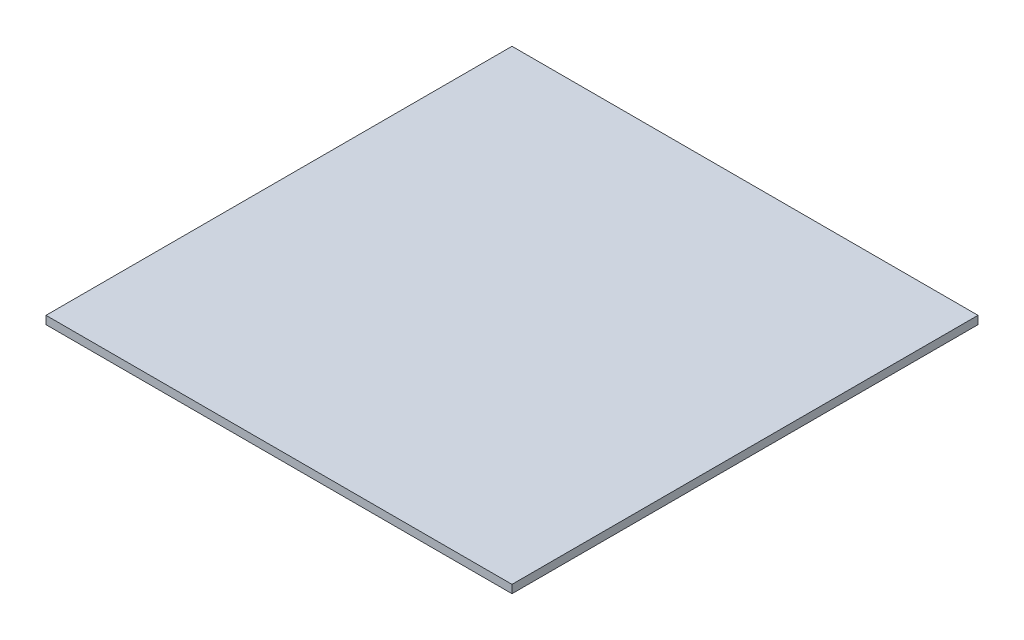
ISO-10303-21;
HEADER;
FILE_DESCRIPTION(('STEP AP214'),'2;1');
FILE_NAME('part.step','',(''),(''),'','','');
FILE_SCHEMA(('AUTOMOTIVE_DESIGN { 1 0 10303 214 1 1 1 1 }'));
ENDSEC;
DATA;
#1=APPLICATION_CONTEXT('core data for automotive mechanical design processes');
#2=APPLICATION_PROTOCOL_DEFINITION('international standard','automotive_design',2000,#1);
#3=PRODUCT_CONTEXT('',#1,'mechanical');
#4=PRODUCT('Part','Part','',(#3));
#5=PRODUCT_RELATED_PRODUCT_CATEGORY('part','',(#4));
#6=PRODUCT_DEFINITION_FORMATION('','',#4);
#7=PRODUCT_DEFINITION_CONTEXT('part definition',#1,'design');
#8=PRODUCT_DEFINITION('design','',#6,#7);
#9=PRODUCT_DEFINITION_SHAPE('','',#8);
#10=(LENGTH_UNIT() NAMED_UNIT(*) SI_UNIT(.MILLI.,.METRE.));
#11=(NAMED_UNIT(*) PLANE_ANGLE_UNIT() SI_UNIT($,.RADIAN.));
#12=(NAMED_UNIT(*) SI_UNIT($,.STERADIAN.) SOLID_ANGLE_UNIT());
#13=UNCERTAINTY_MEASURE_WITH_UNIT(LENGTH_MEASURE(1.E-05),#10,'distance_accuracy_value','');
#14=(GEOMETRIC_REPRESENTATION_CONTEXT(3) GLOBAL_UNCERTAINTY_ASSIGNED_CONTEXT((#13)) GLOBAL_UNIT_ASSIGNED_CONTEXT((#10,
#11,#12)) REPRESENTATION_CONTEXT('',''));
#15=CARTESIAN_POINT('',(0.,0.,0.));
#16=DIRECTION('',(0.,0.,1.));
#17=DIRECTION('',(1.,0.,0.));
#18=AXIS2_PLACEMENT_3D('',#15,#16,#17);
#19=CARTESIAN_POINT('',(1064.35051927814,15.,-4519.85577216972));
#20=DIRECTION('',(-1.,0.,0.));
#21=DIRECTION('',(0.,0.,1.));
#22=AXIS2_PLACEMENT_3D('',#19,#20,#21);
#23=PLANE('',#22);
#24=DIRECTION('',(0.,0.,-1.));
#25=VECTOR('',#24,1.);
#26=CARTESIAN_POINT('',(1064.35051927814,0.,-4519.85577216972));
#27=LINE('',#26,#25);
#28=CARTESIAN_POINT('',(1064.35051927814,0.,-3659.85577216972));
#29=VERTEX_POINT('',#28);
#30=CARTESIAN_POINT('',(1064.35051927814,0.,-4519.85577216972));
#31=VERTEX_POINT('',#30);
#32=EDGE_CURVE('E96',#29,#31,#27,.T.);
#33=ORIENTED_EDGE('',*,*,#32,.T.);
#34=DIRECTION('',(0.,-1.,0.));
#35=VECTOR('',#34,1.);
#36=CARTESIAN_POINT('',(1064.35051927814,15.,-4519.85577216972));
#37=LINE('',#36,#35);
#38=CARTESIAN_POINT('',(1064.35051927814,15.,-4519.85577216972));
#39=VERTEX_POINT('',#38);
#40=EDGE_CURVE('E11',#39,#31,#37,.T.);
#41=ORIENTED_EDGE('',*,*,#40,.F.);
#42=DIRECTION('',(0.,0.,-1.));
#43=VECTOR('',#42,1.);
#44=CARTESIAN_POINT('',(1064.35051927814,15.,-4519.85577216972));
#45=LINE('',#44,#43);
#46=CARTESIAN_POINT('',(1064.35051927814,15.,-3659.85577216972));
#47=VERTEX_POINT('',#46);
#48=EDGE_CURVE('E84',#47,#39,#45,.T.);
#49=ORIENTED_EDGE('',*,*,#48,.F.);
#50=DIRECTION('',(0.,-1.,0.));
#51=VECTOR('',#50,1.);
#52=CARTESIAN_POINT('',(1064.35051927814,15.,-3659.85577216972));
#53=LINE('',#52,#51);
#54=EDGE_CURVE('E92',#47,#29,#53,.T.);
#55=ORIENTED_EDGE('',*,*,#54,.T.);
#56=EDGE_LOOP('',(#33,#41,#49,#55));
#57=FACE_BOUND('',#56,.T.);
#58=ADVANCED_FACE('F33',(#57),#23,.F.);
#59=CARTESIAN_POINT('',(1064.35051927814,15.,-4519.85577216972));
#60=DIRECTION('',(0.,0.,1.));
#61=DIRECTION('',(1.,0.,0.));
#62=AXIS2_PLACEMENT_3D('',#59,#60,#61);
#63=PLANE('',#62);
#64=DIRECTION('',(-1.,0.,0.));
#65=VECTOR('',#64,1.);
#66=CARTESIAN_POINT('',(1064.35051927814,0.,-4519.85577216972));
#67=LINE('',#66,#65);
#68=CARTESIAN_POINT('',(204.350519278142,0.,-4519.85577216972));
#69=VERTEX_POINT('',#68);
#70=EDGE_CURVE('E88',#31,#69,#67,.T.);
#71=ORIENTED_EDGE('',*,*,#70,.T.);
#72=DIRECTION('',(0.,-1.,0.));
#73=VECTOR('',#72,1.);
#74=CARTESIAN_POINT('',(204.350519278142,15.,-4519.85577216972));
#75=LINE('',#74,#73);
#76=CARTESIAN_POINT('',(204.350519278142,15.,-4519.85577216972));
#77=VERTEX_POINT('',#76);
#78=EDGE_CURVE('E41',#77,#69,#75,.T.);
#79=ORIENTED_EDGE('',*,*,#78,.F.);
#80=DIRECTION('',(-1.,0.,0.));
#81=VECTOR('',#80,1.);
#82=CARTESIAN_POINT('',(1064.35051927814,15.,-4519.85577216972));
#83=LINE('',#82,#81);
#84=EDGE_CURVE('E79',#39,#77,#83,.T.);
#85=ORIENTED_EDGE('',*,*,#84,.F.);
#86=ORIENTED_EDGE('',*,*,#40,.T.);
#87=EDGE_LOOP('',(#71,#79,#85,#86));
#88=FACE_BOUND('',#87,.T.);
#89=ADVANCED_FACE('F87',(#88),#63,.F.);
#90=CARTESIAN_POINT('',(204.350519278142,15.,-4519.85577216972));
#91=DIRECTION('',(1.,0.,0.));
#92=DIRECTION('',(0.,0.,-1.));
#93=AXIS2_PLACEMENT_3D('',#90,#91,#92);
#94=PLANE('',#93);
#95=DIRECTION('',(0.,0.,1.));
#96=VECTOR('',#95,1.);
#97=CARTESIAN_POINT('',(204.350519278142,0.,-4519.85577216972));
#98=LINE('',#97,#96);
#99=CARTESIAN_POINT('',(204.350519278142,0.,-3659.85577216972));
#100=VERTEX_POINT('',#99);
#101=EDGE_CURVE('E66',#69,#100,#98,.T.);
#102=ORIENTED_EDGE('',*,*,#101,.T.);
#103=DIRECTION('',(0.,-1.,0.));
#104=VECTOR('',#103,1.);
#105=CARTESIAN_POINT('',(204.350519278142,15.,-3659.85577216972));
#106=LINE('',#105,#104);
#107=CARTESIAN_POINT('',(204.350519278142,15.,-3659.85577216972));
#108=VERTEX_POINT('',#107);
#109=EDGE_CURVE('E89',#108,#100,#106,.T.);
#110=ORIENTED_EDGE('',*,*,#109,.F.);
#111=DIRECTION('',(0.,0.,1.));
#112=VECTOR('',#111,1.);
#113=CARTESIAN_POINT('',(204.350519278142,15.,-4519.85577216972));
#114=LINE('',#113,#112);
#115=EDGE_CURVE('E82',#77,#108,#114,.T.);
#116=ORIENTED_EDGE('',*,*,#115,.F.);
#117=ORIENTED_EDGE('',*,*,#78,.T.);
#118=EDGE_LOOP('',(#102,#110,#116,#117));
#119=FACE_BOUND('',#118,.T.);
#120=ADVANCED_FACE('F90',(#119),#94,.F.);
#121=CARTESIAN_POINT('',(1064.35051927814,15.,-3659.85577216972));
#122=DIRECTION('',(0.,0.,-1.));
#123=DIRECTION('',(-1.,0.,0.));
#124=AXIS2_PLACEMENT_3D('',#121,#122,#123);
#125=PLANE('',#124);
#126=DIRECTION('',(1.,0.,0.));
#127=VECTOR('',#126,1.);
#128=CARTESIAN_POINT('',(1064.35051927814,0.,-3659.85577216972));
#129=LINE('',#128,#127);
#130=EDGE_CURVE('E72',#100,#29,#129,.T.);
#131=ORIENTED_EDGE('',*,*,#130,.T.);
#132=ORIENTED_EDGE('',*,*,#54,.F.);
#133=DIRECTION('',(1.,0.,0.));
#134=VECTOR('',#133,1.);
#135=CARTESIAN_POINT('',(1064.35051927814,15.,-3659.85577216972));
#136=LINE('',#135,#134);
#137=EDGE_CURVE('E49',#108,#47,#136,.T.);
#138=ORIENTED_EDGE('',*,*,#137,.F.);
#139=ORIENTED_EDGE('',*,*,#109,.T.);
#140=EDGE_LOOP('',(#131,#132,#138,#139));
#141=FACE_BOUND('',#140,.T.);
#142=ADVANCED_FACE('F103',(#141),#125,.F.);
#143=CARTESIAN_POINT('',(0.,15.,0.));
#144=DIRECTION('',(0.,-1.,0.));
#145=DIRECTION('',(0.,0.,-1.));
#146=AXIS2_PLACEMENT_3D('',#143,#144,#145);
#147=PLANE('',#146);
#148=ORIENTED_EDGE('',*,*,#48,.T.);
#149=ORIENTED_EDGE('',*,*,#84,.T.);
#150=ORIENTED_EDGE('',*,*,#115,.T.);
#151=ORIENTED_EDGE('',*,*,#137,.T.);
#152=EDGE_LOOP('',(#148,#149,#150,#151));
#153=FACE_BOUND('',#152,.T.);
#154=ADVANCED_FACE('F80',(#153),#147,.F.);
#155=CARTESIAN_POINT('',(0.,0.,0.));
#156=DIRECTION('',(0.,-1.,0.));
#157=DIRECTION('',(0.,0.,-1.));
#158=AXIS2_PLACEMENT_3D('',#155,#156,#157);
#159=PLANE('',#158);
#160=ORIENTED_EDGE('',*,*,#32,.F.);
#161=ORIENTED_EDGE('',*,*,#130,.F.);
#162=ORIENTED_EDGE('',*,*,#101,.F.);
#163=ORIENTED_EDGE('',*,*,#70,.F.);
#164=EDGE_LOOP('',(#160,#161,#162,#163));
#165=FACE_BOUND('',#164,.T.);
#166=ADVANCED_FACE('F106',(#165),#159,.T.);
#167=CLOSED_SHELL('',(#58,#89,#120,#142,#154,#166));
#168=MANIFOLD_SOLID_BREP('B2',#167);
#169=ADVANCED_BREP_SHAPE_REPRESENTATION('',(#18,#168),#14);
#170=SHAPE_DEFINITION_REPRESENTATION(#9,#169);
ENDSEC;
END-ISO-10303-21;
